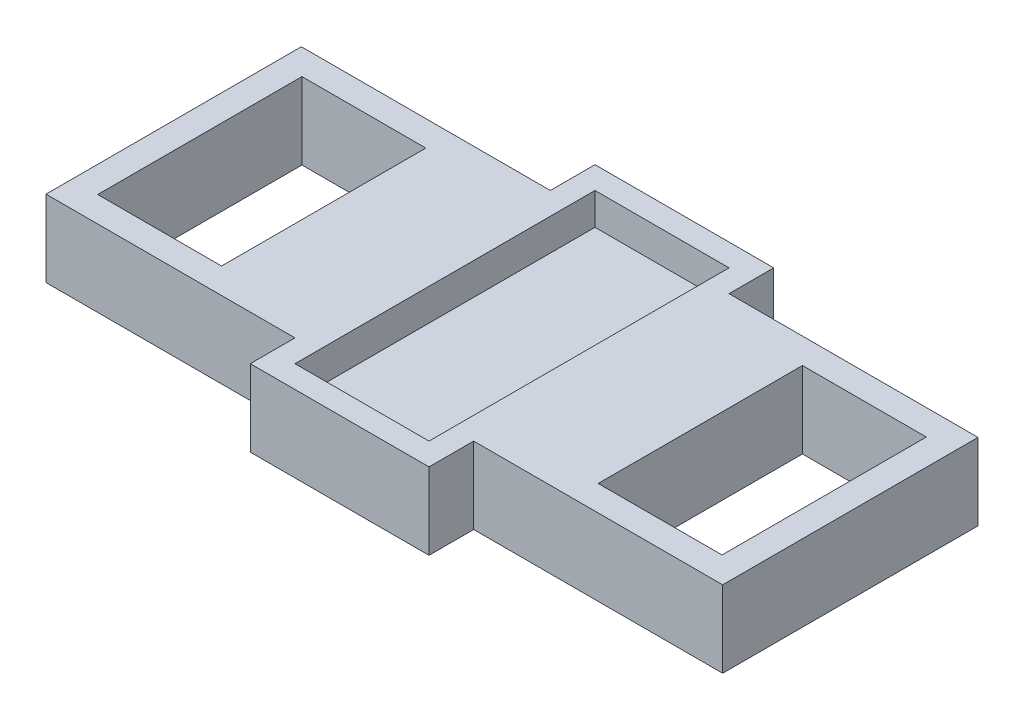
ISO-10303-21;
HEADER;
FILE_DESCRIPTION(('STEP AP214'),'2;1');
FILE_NAME('part.step','',(''),(''),'','','');
FILE_SCHEMA(('AUTOMOTIVE_DESIGN { 1 0 10303 214 1 1 1 1 }'));
ENDSEC;
DATA;
#1=APPLICATION_CONTEXT('core data for automotive mechanical design processes');
#2=APPLICATION_PROTOCOL_DEFINITION('international standard','automotive_design',2000,#1);
#3=PRODUCT_CONTEXT('',#1,'mechanical');
#4=PRODUCT('Part','Part','',(#3));
#5=PRODUCT_RELATED_PRODUCT_CATEGORY('part','',(#4));
#6=PRODUCT_DEFINITION_FORMATION('','',#4);
#7=PRODUCT_DEFINITION_CONTEXT('part definition',#1,'design');
#8=PRODUCT_DEFINITION('design','',#6,#7);
#9=PRODUCT_DEFINITION_SHAPE('','',#8);
#10=(LENGTH_UNIT() NAMED_UNIT(*) SI_UNIT(.MILLI.,.METRE.));
#11=(NAMED_UNIT(*) PLANE_ANGLE_UNIT() SI_UNIT($,.RADIAN.));
#12=(NAMED_UNIT(*) SI_UNIT($,.STERADIAN.) SOLID_ANGLE_UNIT());
#13=UNCERTAINTY_MEASURE_WITH_UNIT(LENGTH_MEASURE(1.E-05),#10,'distance_accuracy_value','');
#14=(GEOMETRIC_REPRESENTATION_CONTEXT(3) GLOBAL_UNCERTAINTY_ASSIGNED_CONTEXT((#13)) GLOBAL_UNIT_ASSIGNED_CONTEXT((#10,
#11,#12)) REPRESENTATION_CONTEXT('',''));
#15=CARTESIAN_POINT('',(0.,0.,0.));
#16=DIRECTION('',(0.,0.,1.));
#17=DIRECTION('',(1.,0.,0.));
#18=AXIS2_PLACEMENT_3D('',#15,#16,#17);
#19=CARTESIAN_POINT('',(0.,6.,0.));
#20=DIRECTION('',(0.,-1.,0.));
#21=DIRECTION('',(0.,0.,-1.));
#22=AXIS2_PLACEMENT_3D('',#19,#20,#21);
#23=PLANE('',#22);
#24=DIRECTION('',(0.,0.,1.));
#25=VECTOR('',#24,1.);
#26=CARTESIAN_POINT('',(24.45,6.,-8.00000000000001));
#27=LINE('',#26,#25);
#28=CARTESIAN_POINT('',(24.45,6.,-8.00000000000001));
#29=VERTEX_POINT('',#28);
#30=CARTESIAN_POINT('',(24.45,6.,7.99999999999999));
#31=VERTEX_POINT('',#30);
#32=EDGE_CURVE('E273',#29,#31,#27,.T.);
#33=ORIENTED_EDGE('',*,*,#32,.T.);
#34=DIRECTION('',(-1.,0.,0.));
#35=VECTOR('',#34,1.);
#36=CARTESIAN_POINT('',(24.45,6.,7.99999999999999));
#37=LINE('',#36,#35);
#38=CARTESIAN_POINT('',(14.75,6.,8.));
#39=VERTEX_POINT('',#38);
#40=EDGE_CURVE('E270',#31,#39,#37,.T.);
#41=ORIENTED_EDGE('',*,*,#40,.T.);
#42=DIRECTION('',(0.,0.,1.));
#43=VECTOR('',#42,1.);
#44=CARTESIAN_POINT('',(14.75,6.,-8.));
#45=LINE('',#44,#43);
#46=CARTESIAN_POINT('',(14.75,6.,-8.));
#47=VERTEX_POINT('',#46);
#48=EDGE_CURVE('E267',#47,#39,#45,.T.);
#49=ORIENTED_EDGE('',*,*,#48,.F.);
#50=DIRECTION('',(-1.,0.,0.));
#51=VECTOR('',#50,1.);
#52=CARTESIAN_POINT('',(24.45,6.,-8.00000000000001));
#53=LINE('',#52,#51);
#54=EDGE_CURVE('E264',#29,#47,#53,.T.);
#55=ORIENTED_EDGE('',*,*,#54,.F.);
#56=EDGE_LOOP('',(#33,#41,#49,#55));
#57=FACE_BOUND('',#56,.T.);
#58=DIRECTION('',(-1.,0.,0.));
#59=VECTOR('',#58,1.);
#60=CARTESIAN_POINT('',(-7.,6.,-10.));
#61=LINE('',#60,#59);
#62=CARTESIAN_POINT('',(-7.,6.,-10.));
#63=VERTEX_POINT('',#62);
#64=CARTESIAN_POINT('',(-26.5,6.,-10.));
#65=VERTEX_POINT('',#64);
#66=EDGE_CURVE('E282',#63,#65,#61,.T.);
#67=ORIENTED_EDGE('',*,*,#66,.T.);
#68=DIRECTION('',(0.,0.,1.));
#69=VECTOR('',#68,1.);
#70=CARTESIAN_POINT('',(-26.5,6.,10.));
#71=LINE('',#70,#69);
#72=CARTESIAN_POINT('',(-26.5,6.,10.));
#73=VERTEX_POINT('',#72);
#74=EDGE_CURVE('E285',#65,#73,#71,.T.);
#75=ORIENTED_EDGE('',*,*,#74,.T.);
#76=DIRECTION('',(1.,0.,0.));
#77=VECTOR('',#76,1.);
#78=CARTESIAN_POINT('',(-7.,6.,10.));
#79=LINE('',#78,#77);
#80=CARTESIAN_POINT('',(-7.,6.,10.));
#81=VERTEX_POINT('',#80);
#82=EDGE_CURVE('E288',#73,#81,#79,.T.);
#83=ORIENTED_EDGE('',*,*,#82,.T.);
#84=DIRECTION('',(0.,0.,1.));
#85=VECTOR('',#84,1.);
#86=CARTESIAN_POINT('',(-7.,6.,13.5));
#87=LINE('',#86,#85);
#88=CARTESIAN_POINT('',(-7.,6.,13.5));
#89=VERTEX_POINT('',#88);
#90=EDGE_CURVE('E290',#81,#89,#87,.T.);
#91=ORIENTED_EDGE('',*,*,#90,.T.);
#92=DIRECTION('',(1.,0.,0.));
#93=VECTOR('',#92,1.);
#94=CARTESIAN_POINT('',(7.,6.,13.5));
#95=LINE('',#94,#93);
#96=CARTESIAN_POINT('',(7.,6.,13.5));
#97=VERTEX_POINT('',#96);
#98=EDGE_CURVE('E292',#89,#97,#95,.T.);
#99=ORIENTED_EDGE('',*,*,#98,.T.);
#100=DIRECTION('',(0.,0.,-1.));
#101=VECTOR('',#100,1.);
#102=CARTESIAN_POINT('',(7.,6.,13.5));
#103=LINE('',#102,#101);
#104=CARTESIAN_POINT('',(7.,6.,10.));
#105=VERTEX_POINT('',#104);
#106=EDGE_CURVE('E294',#97,#105,#103,.T.);
#107=ORIENTED_EDGE('',*,*,#106,.T.);
#108=DIRECTION('',(1.,0.,0.));
#109=VECTOR('',#108,1.);
#110=CARTESIAN_POINT('',(26.5,6.,10.));
#111=LINE('',#110,#109);
#112=CARTESIAN_POINT('',(26.5,6.,10.));
#113=VERTEX_POINT('',#112);
#114=EDGE_CURVE('E296',#105,#113,#111,.T.);
#115=ORIENTED_EDGE('',*,*,#114,.T.);
#116=DIRECTION('',(0.,0.,-1.));
#117=VECTOR('',#116,1.);
#118=CARTESIAN_POINT('',(26.5,6.,10.));
#119=LINE('',#118,#117);
#120=CARTESIAN_POINT('',(26.5,6.,-10.));
#121=VERTEX_POINT('',#120);
#122=EDGE_CURVE('E298',#113,#121,#119,.T.);
#123=ORIENTED_EDGE('',*,*,#122,.T.);
#124=DIRECTION('',(-1.,0.,0.));
#125=VECTOR('',#124,1.);
#126=CARTESIAN_POINT('',(26.5,6.,-10.));
#127=LINE('',#126,#125);
#128=CARTESIAN_POINT('',(7.,6.,-10.));
#129=VERTEX_POINT('',#128);
#130=EDGE_CURVE('E300',#121,#129,#127,.T.);
#131=ORIENTED_EDGE('',*,*,#130,.T.);
#132=DIRECTION('',(0.,0.,-1.));
#133=VECTOR('',#132,1.);
#134=CARTESIAN_POINT('',(7.,6.,-10.));
#135=LINE('',#134,#133);
#136=CARTESIAN_POINT('',(7.,6.,-13.5));
#137=VERTEX_POINT('',#136);
#138=EDGE_CURVE('E302',#129,#137,#135,.T.);
#139=ORIENTED_EDGE('',*,*,#138,.T.);
#140=DIRECTION('',(-1.,0.,0.));
#141=VECTOR('',#140,1.);
#142=CARTESIAN_POINT('',(7.,6.,-13.5));
#143=LINE('',#142,#141);
#144=CARTESIAN_POINT('',(-7.,6.,-13.5));
#145=VERTEX_POINT('',#144);
#146=EDGE_CURVE('E304',#137,#145,#143,.T.);
#147=ORIENTED_EDGE('',*,*,#146,.T.);
#148=DIRECTION('',(0.,0.,1.));
#149=VECTOR('',#148,1.);
#150=CARTESIAN_POINT('',(-7.,6.,-10.));
#151=LINE('',#150,#149);
#152=EDGE_CURVE('E306',#145,#63,#151,.T.);
#153=ORIENTED_EDGE('',*,*,#152,.T.);
#154=EDGE_LOOP('',(#67,#75,#83,#91,#99,#107,#115,#123,#131,#139,#147,#153));
#155=FACE_BOUND('',#154,.T.);
#156=DIRECTION('',(1.,0.,0.));
#157=VECTOR('',#156,1.);
#158=CARTESIAN_POINT('',(-24.45,6.,8.));
#159=LINE('',#158,#157);
#160=CARTESIAN_POINT('',(-24.45,6.,8.));
#161=VERTEX_POINT('',#160);
#162=CARTESIAN_POINT('',(-14.75,6.,8.));
#163=VERTEX_POINT('',#162);
#164=EDGE_CURVE('E235',#161,#163,#159,.T.);
#165=ORIENTED_EDGE('',*,*,#164,.F.);
#166=DIRECTION('',(0.,0.,1.));
#167=VECTOR('',#166,1.);
#168=CARTESIAN_POINT('',(-24.45,6.,-8.));
#169=LINE('',#168,#167);
#170=CARTESIAN_POINT('',(-24.45,6.,-8.));
#171=VERTEX_POINT('',#170);
#172=EDGE_CURVE('E56',#171,#161,#169,.T.);
#173=ORIENTED_EDGE('',*,*,#172,.F.);
#174=DIRECTION('',(1.,0.,0.));
#175=VECTOR('',#174,1.);
#176=CARTESIAN_POINT('',(-24.45,6.,-8.));
#177=LINE('',#176,#175);
#178=CARTESIAN_POINT('',(-14.75,6.,-8.));
#179=VERTEX_POINT('',#178);
#180=EDGE_CURVE('E241',#171,#179,#177,.T.);
#181=ORIENTED_EDGE('',*,*,#180,.T.);
#182=DIRECTION('',(0.,0.,1.));
#183=VECTOR('',#182,1.);
#184=CARTESIAN_POINT('',(-14.75,6.,-8.));
#185=LINE('',#184,#183);
#186=EDGE_CURVE('E238',#179,#163,#185,.T.);
#187=ORIENTED_EDGE('',*,*,#186,.T.);
#188=EDGE_LOOP('',(#165,#173,#181,#187));
#189=FACE_BOUND('',#188,.T.);
#190=DIRECTION('',(0.,0.,-1.));
#191=VECTOR('',#190,1.);
#192=CARTESIAN_POINT('',(-5.25,6.,-11.75));
#193=LINE('',#192,#191);
#194=CARTESIAN_POINT('',(-5.25,6.,11.75));
#195=VERTEX_POINT('',#194);
#196=CARTESIAN_POINT('',(-5.25,6.,-11.75));
#197=VERTEX_POINT('',#196);
#198=EDGE_CURVE('E48',#195,#197,#193,.T.);
#199=ORIENTED_EDGE('',*,*,#198,.T.);
#200=DIRECTION('',(1.,0.,0.));
#201=VECTOR('',#200,1.);
#202=CARTESIAN_POINT('',(5.25,6.,-11.75));
#203=LINE('',#202,#201);
#204=CARTESIAN_POINT('',(5.25,6.,-11.75));
#205=VERTEX_POINT('',#204);
#206=EDGE_CURVE('E214',#197,#205,#203,.T.);
#207=ORIENTED_EDGE('',*,*,#206,.T.);
#208=DIRECTION('',(0.,0.,1.));
#209=VECTOR('',#208,1.);
#210=CARTESIAN_POINT('',(5.25,6.,-11.75));
#211=LINE('',#210,#209);
#212=CARTESIAN_POINT('',(5.25,6.,11.75));
#213=VERTEX_POINT('',#212);
#214=EDGE_CURVE('E663',#205,#213,#211,.T.);
#215=ORIENTED_EDGE('',*,*,#214,.T.);
#216=DIRECTION('',(-1.,0.,0.));
#217=VECTOR('',#216,1.);
#218=CARTESIAN_POINT('',(5.25,6.,11.75));
#219=LINE('',#218,#217);
#220=EDGE_CURVE('E210',#213,#195,#219,.T.);
#221=ORIENTED_EDGE('',*,*,#220,.T.);
#222=EDGE_LOOP('',(#199,#207,#215,#221));
#223=FACE_BOUND('',#222,.T.);
#224=ADVANCED_FACE('F33',(#57,#155,#189,#223),#23,.F.);
#225=CARTESIAN_POINT('',(0.,0.,0.));
#226=DIRECTION('',(0.,-1.,0.));
#227=DIRECTION('',(0.,0.,-1.));
#228=AXIS2_PLACEMENT_3D('',#225,#226,#227);
#229=PLANE('',#228);
#230=DIRECTION('',(0.,0.,1.));
#231=VECTOR('',#230,1.);
#232=CARTESIAN_POINT('',(-24.45,0.,-8.));
#233=LINE('',#232,#231);
#234=CARTESIAN_POINT('',(-24.45,0.,-8.));
#235=VERTEX_POINT('',#234);
#236=CARTESIAN_POINT('',(-24.45,0.,8.));
#237=VERTEX_POINT('',#236);
#238=EDGE_CURVE('E231',#235,#237,#233,.T.);
#239=ORIENTED_EDGE('',*,*,#238,.T.);
#240=DIRECTION('',(1.,0.,0.));
#241=VECTOR('',#240,1.);
#242=CARTESIAN_POINT('',(-24.45,0.,8.));
#243=LINE('',#242,#241);
#244=CARTESIAN_POINT('',(-14.75,0.,8.));
#245=VERTEX_POINT('',#244);
#246=EDGE_CURVE('E247',#237,#245,#243,.T.);
#247=ORIENTED_EDGE('',*,*,#246,.T.);
#248=DIRECTION('',(0.,0.,1.));
#249=VECTOR('',#248,1.);
#250=CARTESIAN_POINT('',(-14.75,0.,-8.));
#251=LINE('',#250,#249);
#252=CARTESIAN_POINT('',(-14.75,0.,-8.));
#253=VERTEX_POINT('',#252);
#254=EDGE_CURVE('E225',#253,#245,#251,.T.);
#255=ORIENTED_EDGE('',*,*,#254,.F.);
#256=DIRECTION('',(1.,0.,0.));
#257=VECTOR('',#256,1.);
#258=CARTESIAN_POINT('',(-24.45,0.,-8.));
#259=LINE('',#258,#257);
#260=EDGE_CURVE('E228',#235,#253,#259,.T.);
#261=ORIENTED_EDGE('',*,*,#260,.F.);
#262=EDGE_LOOP('',(#239,#247,#255,#261));
#263=FACE_BOUND('',#262,.T.);
#264=DIRECTION('',(-1.,0.,0.));
#265=VECTOR('',#264,1.);
#266=CARTESIAN_POINT('',(-7.,0.,-10.));
#267=LINE('',#266,#265);
#268=CARTESIAN_POINT('',(-7.,0.,-10.));
#269=VERTEX_POINT('',#268);
#270=CARTESIAN_POINT('',(-26.5,0.,-10.));
#271=VERTEX_POINT('',#270);
#272=EDGE_CURVE('E254',#269,#271,#267,.T.);
#273=ORIENTED_EDGE('',*,*,#272,.F.);
#274=DIRECTION('',(0.,0.,1.));
#275=VECTOR('',#274,1.);
#276=CARTESIAN_POINT('',(-7.,0.,-10.));
#277=LINE('',#276,#275);
#278=CARTESIAN_POINT('',(-7.,0.,-13.5));
#279=VERTEX_POINT('',#278);
#280=EDGE_CURVE('E286',#279,#269,#277,.T.);
#281=ORIENTED_EDGE('',*,*,#280,.F.);
#282=DIRECTION('',(-1.,0.,0.));
#283=VECTOR('',#282,1.);
#284=CARTESIAN_POINT('',(7.,0.,-13.5));
#285=LINE('',#284,#283);
#286=CARTESIAN_POINT('',(7.,0.,-13.5));
#287=VERTEX_POINT('',#286);
#288=EDGE_CURVE('E329',#287,#279,#285,.T.);
#289=ORIENTED_EDGE('',*,*,#288,.F.);
#290=DIRECTION('',(0.,0.,-1.));
#291=VECTOR('',#290,1.);
#292=CARTESIAN_POINT('',(7.,0.,-10.));
#293=LINE('',#292,#291);
#294=CARTESIAN_POINT('',(7.,0.,-10.));
#295=VERTEX_POINT('',#294);
#296=EDGE_CURVE('E327',#295,#287,#293,.T.);
#297=ORIENTED_EDGE('',*,*,#296,.F.);
#298=DIRECTION('',(-1.,0.,0.));
#299=VECTOR('',#298,1.);
#300=CARTESIAN_POINT('',(26.5,0.,-10.));
#301=LINE('',#300,#299);
#302=CARTESIAN_POINT('',(26.5,0.,-10.));
#303=VERTEX_POINT('',#302);
#304=EDGE_CURVE('E325',#303,#295,#301,.T.);
#305=ORIENTED_EDGE('',*,*,#304,.F.);
#306=DIRECTION('',(0.,0.,-1.));
#307=VECTOR('',#306,1.);
#308=CARTESIAN_POINT('',(26.5,0.,10.));
#309=LINE('',#308,#307);
#310=CARTESIAN_POINT('',(26.5,0.,10.));
#311=VERTEX_POINT('',#310);
#312=EDGE_CURVE('E323',#311,#303,#309,.T.);
#313=ORIENTED_EDGE('',*,*,#312,.F.);
#314=DIRECTION('',(1.,0.,0.));
#315=VECTOR('',#314,1.);
#316=CARTESIAN_POINT('',(26.5,0.,10.));
#317=LINE('',#316,#315);
#318=CARTESIAN_POINT('',(7.,0.,10.));
#319=VERTEX_POINT('',#318);
#320=EDGE_CURVE('E321',#319,#311,#317,.T.);
#321=ORIENTED_EDGE('',*,*,#320,.F.);
#322=DIRECTION('',(0.,0.,-1.));
#323=VECTOR('',#322,1.);
#324=CARTESIAN_POINT('',(7.,0.,13.5));
#325=LINE('',#324,#323);
#326=CARTESIAN_POINT('',(7.,0.,13.5));
#327=VERTEX_POINT('',#326);
#328=EDGE_CURVE('E319',#327,#319,#325,.T.);
#329=ORIENTED_EDGE('',*,*,#328,.F.);
#330=DIRECTION('',(1.,0.,0.));
#331=VECTOR('',#330,1.);
#332=CARTESIAN_POINT('',(7.,0.,13.5));
#333=LINE('',#332,#331);
#334=CARTESIAN_POINT('',(-7.,0.,13.5));
#335=VERTEX_POINT('',#334);
#336=EDGE_CURVE('E317',#335,#327,#333,.T.);
#337=ORIENTED_EDGE('',*,*,#336,.F.);
#338=DIRECTION('',(0.,0.,1.));
#339=VECTOR('',#338,1.);
#340=CARTESIAN_POINT('',(-7.,0.,13.5));
#341=LINE('',#340,#339);
#342=CARTESIAN_POINT('',(-7.,0.,10.));
#343=VERTEX_POINT('',#342);
#344=EDGE_CURVE('E315',#343,#335,#341,.T.);
#345=ORIENTED_EDGE('',*,*,#344,.F.);
#346=DIRECTION('',(1.,0.,0.));
#347=VECTOR('',#346,1.);
#348=CARTESIAN_POINT('',(-7.,0.,10.));
#349=LINE('',#348,#347);
#350=CARTESIAN_POINT('',(-26.5,0.,10.));
#351=VERTEX_POINT('',#350);
#352=EDGE_CURVE('E313',#351,#343,#349,.T.);
#353=ORIENTED_EDGE('',*,*,#352,.F.);
#354=DIRECTION('',(0.,0.,1.));
#355=VECTOR('',#354,1.);
#356=CARTESIAN_POINT('',(-26.5,0.,10.));
#357=LINE('',#356,#355);
#358=EDGE_CURVE('E311',#271,#351,#357,.T.);
#359=ORIENTED_EDGE('',*,*,#358,.F.);
#360=EDGE_LOOP('',(#273,#281,#289,#297,#305,#313,#321,#329,#337,#345,#353,#359));
#361=FACE_BOUND('',#360,.T.);
#362=DIRECTION('',(-1.,0.,0.));
#363=VECTOR('',#362,1.);
#364=CARTESIAN_POINT('',(24.45,0.,7.99999999999999));
#365=LINE('',#364,#363);
#366=CARTESIAN_POINT('',(24.45,0.,7.99999999999999));
#367=VERTEX_POINT('',#366);
#368=CARTESIAN_POINT('',(14.75,0.,8.));
#369=VERTEX_POINT('',#368);
#370=EDGE_CURVE('E278',#367,#369,#365,.T.);
#371=ORIENTED_EDGE('',*,*,#370,.F.);
#372=DIRECTION('',(0.,0.,1.));
#373=VECTOR('',#372,1.);
#374=CARTESIAN_POINT('',(24.45,0.,-8.00000000000001));
#375=LINE('',#374,#373);
#376=CARTESIAN_POINT('',(24.45,0.,-8.00000000000001));
#377=VERTEX_POINT('',#376);
#378=EDGE_CURVE('E276',#377,#367,#375,.T.);
#379=ORIENTED_EDGE('',*,*,#378,.F.);
#380=DIRECTION('',(-1.,0.,0.));
#381=VECTOR('',#380,1.);
#382=CARTESIAN_POINT('',(24.45,0.,-8.00000000000001));
#383=LINE('',#382,#381);
#384=CARTESIAN_POINT('',(14.75,0.,-8.));
#385=VERTEX_POINT('',#384);
#386=EDGE_CURVE('E215',#377,#385,#383,.T.);
#387=ORIENTED_EDGE('',*,*,#386,.T.);
#388=DIRECTION('',(0.,0.,1.));
#389=VECTOR('',#388,1.);
#390=CARTESIAN_POINT('',(14.75,0.,-8.));
#391=LINE('',#390,#389);
#392=EDGE_CURVE('E229',#385,#369,#391,.T.);
#393=ORIENTED_EDGE('',*,*,#392,.T.);
#394=EDGE_LOOP('',(#371,#379,#387,#393));
#395=FACE_BOUND('',#394,.T.);
#396=ADVANCED_FACE('F371',(#263,#361,#395),#229,.T.);
#397=CARTESIAN_POINT('',(-7.,6.,-10.));
#398=DIRECTION('',(0.,0.,1.));
#399=DIRECTION('',(1.,0.,0.));
#400=AXIS2_PLACEMENT_3D('',#397,#398,#399);
#401=PLANE('',#400);
#402=ORIENTED_EDGE('',*,*,#272,.T.);
#403=DIRECTION('',(0.,-1.,0.));
#404=VECTOR('',#403,1.);
#405=CARTESIAN_POINT('',(-26.5,6.,-10.));
#406=LINE('',#405,#404);
#407=EDGE_CURVE('E11',#65,#271,#406,.T.);
#408=ORIENTED_EDGE('',*,*,#407,.F.);
#409=ORIENTED_EDGE('',*,*,#66,.F.);
#410=DIRECTION('',(0.,-1.,0.));
#411=VECTOR('',#410,1.);
#412=CARTESIAN_POINT('',(-7.,6.,-10.));
#413=LINE('',#412,#411);
#414=EDGE_CURVE('E308',#63,#269,#413,.T.);
#415=ORIENTED_EDGE('',*,*,#414,.T.);
#416=EDGE_LOOP('',(#402,#408,#409,#415));
#417=FACE_BOUND('',#416,.T.);
#418=ADVANCED_FACE('F35',(#417),#401,.F.);
#419=CARTESIAN_POINT('',(-26.5,6.,10.));
#420=DIRECTION('',(1.,0.,0.));
#421=DIRECTION('',(0.,0.,-1.));
#422=AXIS2_PLACEMENT_3D('',#419,#420,#421);
#423=PLANE('',#422);
#424=ORIENTED_EDGE('',*,*,#358,.T.);
#425=DIRECTION('',(0.,-1.,0.));
#426=VECTOR('',#425,1.);
#427=CARTESIAN_POINT('',(-26.5,6.,10.));
#428=LINE('',#427,#426);
#429=EDGE_CURVE('E41',#73,#351,#428,.T.);
#430=ORIENTED_EDGE('',*,*,#429,.F.);
#431=ORIENTED_EDGE('',*,*,#74,.F.);
#432=ORIENTED_EDGE('',*,*,#407,.T.);
#433=EDGE_LOOP('',(#424,#430,#431,#432));
#434=FACE_BOUND('',#433,.T.);
#435=ADVANCED_FACE('F389',(#434),#423,.F.);
#436=CARTESIAN_POINT('',(-7.,6.,10.));
#437=DIRECTION('',(0.,0.,-1.));
#438=DIRECTION('',(-1.,0.,0.));
#439=AXIS2_PLACEMENT_3D('',#436,#437,#438);
#440=PLANE('',#439);
#441=ORIENTED_EDGE('',*,*,#352,.T.);
#442=DIRECTION('',(0.,-1.,0.));
#443=VECTOR('',#442,1.);
#444=CARTESIAN_POINT('',(-7.,6.,10.));
#445=LINE('',#444,#443);
#446=EDGE_CURVE('E358',#81,#343,#445,.T.);
#447=ORIENTED_EDGE('',*,*,#446,.F.);
#448=ORIENTED_EDGE('',*,*,#82,.F.);
#449=ORIENTED_EDGE('',*,*,#429,.T.);
#450=EDGE_LOOP('',(#441,#447,#448,#449));
#451=FACE_BOUND('',#450,.T.);
#452=ADVANCED_FACE('F365',(#451),#440,.F.);
#453=CARTESIAN_POINT('',(-7.,6.,13.5));
#454=DIRECTION('',(1.,0.,0.));
#455=DIRECTION('',(0.,0.,-1.));
#456=AXIS2_PLACEMENT_3D('',#453,#454,#455);
#457=PLANE('',#456);
#458=ORIENTED_EDGE('',*,*,#344,.T.);
#459=DIRECTION('',(0.,-1.,0.));
#460=VECTOR('',#459,1.);
#461=CARTESIAN_POINT('',(-7.,6.,13.5));
#462=LINE('',#461,#460);
#463=EDGE_CURVE('E355',#89,#335,#462,.T.);
#464=ORIENTED_EDGE('',*,*,#463,.F.);
#465=ORIENTED_EDGE('',*,*,#90,.F.);
#466=ORIENTED_EDGE('',*,*,#446,.T.);
#467=EDGE_LOOP('',(#458,#464,#465,#466));
#468=FACE_BOUND('',#467,.T.);
#469=ADVANCED_FACE('F377',(#468),#457,.F.);
#470=CARTESIAN_POINT('',(7.,6.,13.5));
#471=DIRECTION('',(0.,0.,-1.));
#472=DIRECTION('',(-1.,0.,0.));
#473=AXIS2_PLACEMENT_3D('',#470,#471,#472);
#474=PLANE('',#473);
#475=ORIENTED_EDGE('',*,*,#336,.T.);
#476=DIRECTION('',(0.,-1.,0.));
#477=VECTOR('',#476,1.);
#478=CARTESIAN_POINT('',(7.,6.,13.5));
#479=LINE('',#478,#477);
#480=EDGE_CURVE('E352',#97,#327,#479,.T.);
#481=ORIENTED_EDGE('',*,*,#480,.F.);
#482=ORIENTED_EDGE('',*,*,#98,.F.);
#483=ORIENTED_EDGE('',*,*,#463,.T.);
#484=EDGE_LOOP('',(#475,#481,#482,#483));
#485=FACE_BOUND('',#484,.T.);
#486=ADVANCED_FACE('F381',(#485),#474,.F.);
#487=CARTESIAN_POINT('',(7.,6.,13.5));
#488=DIRECTION('',(-1.,0.,0.));
#489=DIRECTION('',(0.,0.,1.));
#490=AXIS2_PLACEMENT_3D('',#487,#488,#489);
#491=PLANE('',#490);
#492=ORIENTED_EDGE('',*,*,#328,.T.);
#493=DIRECTION('',(0.,-1.,0.));
#494=VECTOR('',#493,1.);
#495=CARTESIAN_POINT('',(7.,6.,10.));
#496=LINE('',#495,#494);
#497=EDGE_CURVE('E349',#105,#319,#496,.T.);
#498=ORIENTED_EDGE('',*,*,#497,.F.);
#499=ORIENTED_EDGE('',*,*,#106,.F.);
#500=ORIENTED_EDGE('',*,*,#480,.T.);
#501=EDGE_LOOP('',(#492,#498,#499,#500));
#502=FACE_BOUND('',#501,.T.);
#503=ADVANCED_FACE('F422',(#502),#491,.F.);
#504=CARTESIAN_POINT('',(26.5,6.,10.));
#505=DIRECTION('',(0.,0.,-1.));
#506=DIRECTION('',(-1.,0.,0.));
#507=AXIS2_PLACEMENT_3D('',#504,#505,#506);
#508=PLANE('',#507);
#509=ORIENTED_EDGE('',*,*,#320,.T.);
#510=DIRECTION('',(0.,-1.,0.));
#511=VECTOR('',#510,1.);
#512=CARTESIAN_POINT('',(26.5,6.,10.));
#513=LINE('',#512,#511);
#514=EDGE_CURVE('E346',#113,#311,#513,.T.);
#515=ORIENTED_EDGE('',*,*,#514,.F.);
#516=ORIENTED_EDGE('',*,*,#114,.F.);
#517=ORIENTED_EDGE('',*,*,#497,.T.);
#518=EDGE_LOOP('',(#509,#515,#516,#517));
#519=FACE_BOUND('',#518,.T.);
#520=ADVANCED_FACE('F420',(#519),#508,.F.);
#521=CARTESIAN_POINT('',(26.5,6.,10.));
#522=DIRECTION('',(-1.,0.,0.));
#523=DIRECTION('',(0.,0.,1.));
#524=AXIS2_PLACEMENT_3D('',#521,#522,#523);
#525=PLANE('',#524);
#526=ORIENTED_EDGE('',*,*,#312,.T.);
#527=DIRECTION('',(0.,-1.,0.));
#528=VECTOR('',#527,1.);
#529=CARTESIAN_POINT('',(26.5,6.,-10.));
#530=LINE('',#529,#528);
#531=EDGE_CURVE('E343',#121,#303,#530,.T.);
#532=ORIENTED_EDGE('',*,*,#531,.F.);
#533=ORIENTED_EDGE('',*,*,#122,.F.);
#534=ORIENTED_EDGE('',*,*,#514,.T.);
#535=EDGE_LOOP('',(#526,#532,#533,#534));
#536=FACE_BOUND('',#535,.T.);
#537=ADVANCED_FACE('F416',(#536),#525,.F.);
#538=CARTESIAN_POINT('',(26.5,6.,-10.));
#539=DIRECTION('',(0.,0.,1.));
#540=DIRECTION('',(1.,0.,0.));
#541=AXIS2_PLACEMENT_3D('',#538,#539,#540);
#542=PLANE('',#541);
#543=ORIENTED_EDGE('',*,*,#304,.T.);
#544=DIRECTION('',(0.,-1.,0.));
#545=VECTOR('',#544,1.);
#546=CARTESIAN_POINT('',(7.,6.,-10.));
#547=LINE('',#546,#545);
#548=EDGE_CURVE('E340',#129,#295,#547,.T.);
#549=ORIENTED_EDGE('',*,*,#548,.F.);
#550=ORIENTED_EDGE('',*,*,#130,.F.);
#551=ORIENTED_EDGE('',*,*,#531,.T.);
#552=EDGE_LOOP('',(#543,#549,#550,#551));
#553=FACE_BOUND('',#552,.T.);
#554=ADVANCED_FACE('F411',(#553),#542,.F.);
#555=CARTESIAN_POINT('',(7.,6.,-10.));
#556=DIRECTION('',(-1.,0.,0.));
#557=DIRECTION('',(0.,0.,1.));
#558=AXIS2_PLACEMENT_3D('',#555,#556,#557);
#559=PLANE('',#558);
#560=ORIENTED_EDGE('',*,*,#296,.T.);
#561=DIRECTION('',(0.,-1.,0.));
#562=VECTOR('',#561,1.);
#563=CARTESIAN_POINT('',(7.,6.,-13.5));
#564=LINE('',#563,#562);
#565=EDGE_CURVE('E337',#137,#287,#564,.T.);
#566=ORIENTED_EDGE('',*,*,#565,.F.);
#567=ORIENTED_EDGE('',*,*,#138,.F.);
#568=ORIENTED_EDGE('',*,*,#548,.T.);
#569=EDGE_LOOP('',(#560,#566,#567,#568));
#570=FACE_BOUND('',#569,.T.);
#571=ADVANCED_FACE('F405',(#570),#559,.F.);
#572=CARTESIAN_POINT('',(7.,6.,-13.5));
#573=DIRECTION('',(0.,0.,1.));
#574=DIRECTION('',(1.,0.,0.));
#575=AXIS2_PLACEMENT_3D('',#572,#573,#574);
#576=PLANE('',#575);
#577=ORIENTED_EDGE('',*,*,#288,.T.);
#578=DIRECTION('',(0.,-1.,0.));
#579=VECTOR('',#578,1.);
#580=CARTESIAN_POINT('',(-7.,6.,-13.5));
#581=LINE('',#580,#579);
#582=EDGE_CURVE('E334',#145,#279,#581,.T.);
#583=ORIENTED_EDGE('',*,*,#582,.F.);
#584=ORIENTED_EDGE('',*,*,#146,.F.);
#585=ORIENTED_EDGE('',*,*,#565,.T.);
#586=EDGE_LOOP('',(#577,#583,#584,#585));
#587=FACE_BOUND('',#586,.T.);
#588=ADVANCED_FACE('F401',(#587),#576,.F.);
#589=CARTESIAN_POINT('',(-7.,6.,-10.));
#590=DIRECTION('',(1.,0.,0.));
#591=DIRECTION('',(0.,0.,-1.));
#592=AXIS2_PLACEMENT_3D('',#589,#590,#591);
#593=PLANE('',#592);
#594=ORIENTED_EDGE('',*,*,#280,.T.);
#595=ORIENTED_EDGE('',*,*,#414,.F.);
#596=ORIENTED_EDGE('',*,*,#152,.F.);
#597=ORIENTED_EDGE('',*,*,#582,.T.);
#598=EDGE_LOOP('',(#594,#595,#596,#597));
#599=FACE_BOUND('',#598,.T.);
#600=ADVANCED_FACE('F396',(#599),#593,.F.);
#601=CARTESIAN_POINT('',(24.45,-0.00100000000000013,-8.00000000000001));
#602=DIRECTION('',(-1.,0.,0.));
#603=DIRECTION('',(0.,0.,1.));
#604=AXIS2_PLACEMENT_3D('',#601,#602,#603);
#605=PLANE('',#604);
#606=ORIENTED_EDGE('',*,*,#378,.T.);
#607=DIRECTION('',(0.,1.,0.));
#608=VECTOR('',#607,1.);
#609=CARTESIAN_POINT('',(24.45,-0.00100000000000013,7.99999999999999));
#610=LINE('',#609,#608);
#611=EDGE_CURVE('E219',#367,#31,#610,.T.);
#612=ORIENTED_EDGE('',*,*,#611,.T.);
#613=ORIENTED_EDGE('',*,*,#32,.F.);
#614=DIRECTION('',(0.,1.,0.));
#615=VECTOR('',#614,1.);
#616=CARTESIAN_POINT('',(24.45,-0.00100000000000013,-8.00000000000001));
#617=LINE('',#616,#615);
#618=EDGE_CURVE('E261',#377,#29,#617,.T.);
#619=ORIENTED_EDGE('',*,*,#618,.F.);
#620=EDGE_LOOP('',(#606,#612,#613,#619));
#621=FACE_BOUND('',#620,.T.);
#622=ADVANCED_FACE('F445',(#621),#605,.T.);
#623=CARTESIAN_POINT('',(24.45,-0.00100000000000013,7.99999999999999));
#624=DIRECTION('',(0.,0.,-1.));
#625=DIRECTION('',(-1.,0.,0.));
#626=AXIS2_PLACEMENT_3D('',#623,#624,#625);
#627=PLANE('',#626);
#628=ORIENTED_EDGE('',*,*,#370,.T.);
#629=DIRECTION('',(0.,1.,0.));
#630=VECTOR('',#629,1.);
#631=CARTESIAN_POINT('',(14.75,-0.00100000000000013,8.));
#632=LINE('',#631,#630);
#633=EDGE_CURVE('E257',#369,#39,#632,.T.);
#634=ORIENTED_EDGE('',*,*,#633,.T.);
#635=ORIENTED_EDGE('',*,*,#40,.F.);
#636=ORIENTED_EDGE('',*,*,#611,.F.);
#637=EDGE_LOOP('',(#628,#634,#635,#636));
#638=FACE_BOUND('',#637,.T.);
#639=ADVANCED_FACE('F480',(#638),#627,.T.);
#640=CARTESIAN_POINT('',(14.75,-0.00100000000000013,-8.));
#641=DIRECTION('',(-1.,0.,0.));
#642=DIRECTION('',(0.,0.,1.));
#643=AXIS2_PLACEMENT_3D('',#640,#641,#642);
#644=PLANE('',#643);
#645=DIRECTION('',(0.,1.,0.));
#646=VECTOR('',#645,1.);
#647=CARTESIAN_POINT('',(14.75,-0.00100000000000013,-8.));
#648=LINE('',#647,#646);
#649=EDGE_CURVE('E259',#385,#47,#648,.T.);
#650=ORIENTED_EDGE('',*,*,#649,.T.);
#651=ORIENTED_EDGE('',*,*,#48,.T.);
#652=ORIENTED_EDGE('',*,*,#633,.F.);
#653=ORIENTED_EDGE('',*,*,#392,.F.);
#654=EDGE_LOOP('',(#650,#651,#652,#653));
#655=FACE_BOUND('',#654,.T.);
#656=ADVANCED_FACE('F488',(#655),#644,.F.);
#657=CARTESIAN_POINT('',(24.45,-0.00100000000000013,-8.00000000000001));
#658=DIRECTION('',(0.,0.,-1.));
#659=DIRECTION('',(-1.,0.,0.));
#660=AXIS2_PLACEMENT_3D('',#657,#658,#659);
#661=PLANE('',#660);
#662=ORIENTED_EDGE('',*,*,#618,.T.);
#663=ORIENTED_EDGE('',*,*,#54,.T.);
#664=ORIENTED_EDGE('',*,*,#649,.F.);
#665=ORIENTED_EDGE('',*,*,#386,.F.);
#666=EDGE_LOOP('',(#662,#663,#664,#665));
#667=FACE_BOUND('',#666,.T.);
#668=ADVANCED_FACE('F440',(#667),#661,.F.);
#669=CARTESIAN_POINT('',(-24.45,-0.00100000000000013,-8.));
#670=DIRECTION('',(-1.,0.,0.));
#671=DIRECTION('',(0.,0.,1.));
#672=AXIS2_PLACEMENT_3D('',#669,#670,#671);
#673=PLANE('',#672);
#674=DIRECTION('',(0.,1.,0.));
#675=VECTOR('',#674,1.);
#676=CARTESIAN_POINT('',(-24.45,-0.00100000000000013,-8.));
#677=LINE('',#676,#675);
#678=EDGE_CURVE('E245',#235,#171,#677,.T.);
#679=ORIENTED_EDGE('',*,*,#678,.T.);
#680=ORIENTED_EDGE('',*,*,#172,.T.);
#681=DIRECTION('',(0.,1.,0.));
#682=VECTOR('',#681,1.);
#683=CARTESIAN_POINT('',(-24.45,-0.00100000000000013,8.));
#684=LINE('',#683,#682);
#685=EDGE_CURVE('E244',#237,#161,#684,.T.);
#686=ORIENTED_EDGE('',*,*,#685,.F.);
#687=ORIENTED_EDGE('',*,*,#238,.F.);
#688=EDGE_LOOP('',(#679,#680,#686,#687));
#689=FACE_BOUND('',#688,.T.);
#690=ADVANCED_FACE('F502',(#689),#673,.F.);
#691=CARTESIAN_POINT('',(-24.45,-0.00100000000000013,-8.));
#692=DIRECTION('',(0.,0.,1.));
#693=DIRECTION('',(1.,0.,0.));
#694=AXIS2_PLACEMENT_3D('',#691,#692,#693);
#695=PLANE('',#694);
#696=ORIENTED_EDGE('',*,*,#260,.T.);
#697=DIRECTION('',(0.,1.,0.));
#698=VECTOR('',#697,1.);
#699=CARTESIAN_POINT('',(-14.75,-0.00100000000000013,-8.));
#700=LINE('',#699,#698);
#701=EDGE_CURVE('E248',#253,#179,#700,.T.);
#702=ORIENTED_EDGE('',*,*,#701,.T.);
#703=ORIENTED_EDGE('',*,*,#180,.F.);
#704=ORIENTED_EDGE('',*,*,#678,.F.);
#705=EDGE_LOOP('',(#696,#702,#703,#704));
#706=FACE_BOUND('',#705,.T.);
#707=ADVANCED_FACE('F509',(#706),#695,.T.);
#708=CARTESIAN_POINT('',(-14.75,-0.00100000000000013,-8.));
#709=DIRECTION('',(-1.,0.,0.));
#710=DIRECTION('',(0.,0.,1.));
#711=AXIS2_PLACEMENT_3D('',#708,#709,#710);
#712=PLANE('',#711);
#713=ORIENTED_EDGE('',*,*,#254,.T.);
#714=DIRECTION('',(0.,1.,0.));
#715=VECTOR('',#714,1.);
#716=CARTESIAN_POINT('',(-14.75,-0.00100000000000013,8.));
#717=LINE('',#716,#715);
#718=EDGE_CURVE('E250',#245,#163,#717,.T.);
#719=ORIENTED_EDGE('',*,*,#718,.T.);
#720=ORIENTED_EDGE('',*,*,#186,.F.);
#721=ORIENTED_EDGE('',*,*,#701,.F.);
#722=EDGE_LOOP('',(#713,#719,#720,#721));
#723=FACE_BOUND('',#722,.T.);
#724=ADVANCED_FACE('F516',(#723),#712,.T.);
#725=CARTESIAN_POINT('',(-24.45,-0.00100000000000013,8.));
#726=DIRECTION('',(0.,0.,1.));
#727=DIRECTION('',(1.,0.,0.));
#728=AXIS2_PLACEMENT_3D('',#725,#726,#727);
#729=PLANE('',#728);
#730=ORIENTED_EDGE('',*,*,#685,.T.);
#731=ORIENTED_EDGE('',*,*,#164,.T.);
#732=ORIENTED_EDGE('',*,*,#718,.F.);
#733=ORIENTED_EDGE('',*,*,#246,.F.);
#734=EDGE_LOOP('',(#730,#731,#732,#733));
#735=FACE_BOUND('',#734,.T.);
#736=ADVANCED_FACE('F524',(#735),#729,.F.);
#737=CARTESIAN_POINT('',(-5.25,3.5,-11.75));
#738=DIRECTION('',(1.,0.,0.));
#739=DIRECTION('',(0.,0.,-1.));
#740=AXIS2_PLACEMENT_3D('',#737,#738,#739);
#741=PLANE('',#740);
#742=ORIENTED_EDGE('',*,*,#198,.F.);
#743=DIRECTION('',(0.,1.,0.));
#744=VECTOR('',#743,1.);
#745=CARTESIAN_POINT('',(-5.25,3.5,11.75));
#746=LINE('',#745,#744);
#747=CARTESIAN_POINT('',(-5.25,3.5,11.75));
#748=VERTEX_POINT('',#747);
#749=EDGE_CURVE('E209',#748,#195,#746,.T.);
#750=ORIENTED_EDGE('',*,*,#749,.F.);
#751=DIRECTION('',(0.,0.,-1.));
#752=VECTOR('',#751,1.);
#753=CARTESIAN_POINT('',(-5.25,3.5,-11.75));
#754=LINE('',#753,#752);
#755=CARTESIAN_POINT('',(-5.25,3.5,-11.75));
#756=VERTEX_POINT('',#755);
#757=EDGE_CURVE('E201',#748,#756,#754,.T.);
#758=ORIENTED_EDGE('',*,*,#757,.T.);
#759=DIRECTION('',(0.,1.,0.));
#760=VECTOR('',#759,1.);
#761=CARTESIAN_POINT('',(-5.25,3.5,-11.75));
#762=LINE('',#761,#760);
#763=EDGE_CURVE('E208',#756,#197,#762,.T.);
#764=ORIENTED_EDGE('',*,*,#763,.T.);
#765=EDGE_LOOP('',(#742,#750,#758,#764));
#766=FACE_BOUND('',#765,.T.);
#767=ADVANCED_FACE('F207',(#766),#741,.T.);
#768=CARTESIAN_POINT('',(5.25,3.5,-11.75));
#769=DIRECTION('',(0.,0.,1.));
#770=DIRECTION('',(1.,0.,0.));
#771=AXIS2_PLACEMENT_3D('',#768,#769,#770);
#772=PLANE('',#771);
#773=ORIENTED_EDGE('',*,*,#206,.F.);
#774=ORIENTED_EDGE('',*,*,#763,.F.);
#775=DIRECTION('',(1.,0.,0.));
#776=VECTOR('',#775,1.);
#777=CARTESIAN_POINT('',(5.25,3.5,-11.75));
#778=LINE('',#777,#776);
#779=CARTESIAN_POINT('',(5.25,3.5,-11.75));
#780=VERTEX_POINT('',#779);
#781=EDGE_CURVE('E197',#756,#780,#778,.T.);
#782=ORIENTED_EDGE('',*,*,#781,.T.);
#783=DIRECTION('',(0.,1.,0.));
#784=VECTOR('',#783,1.);
#785=CARTESIAN_POINT('',(5.25,3.5,-11.75));
#786=LINE('',#785,#784);
#787=EDGE_CURVE('E216',#780,#205,#786,.T.);
#788=ORIENTED_EDGE('',*,*,#787,.T.);
#789=EDGE_LOOP('',(#773,#774,#782,#788));
#790=FACE_BOUND('',#789,.T.);
#791=ADVANCED_FACE('F212',(#790),#772,.T.);
#792=CARTESIAN_POINT('',(5.25,3.5,-11.75));
#793=DIRECTION('',(-1.,0.,0.));
#794=DIRECTION('',(0.,0.,1.));
#795=AXIS2_PLACEMENT_3D('',#792,#793,#794);
#796=PLANE('',#795);
#797=ORIENTED_EDGE('',*,*,#214,.F.);
#798=ORIENTED_EDGE('',*,*,#787,.F.);
#799=DIRECTION('',(0.,0.,1.));
#800=VECTOR('',#799,1.);
#801=CARTESIAN_POINT('',(5.25,3.5,-11.75));
#802=LINE('',#801,#800);
#803=CARTESIAN_POINT('',(5.25,3.5,11.75));
#804=VERTEX_POINT('',#803);
#805=EDGE_CURVE('E202',#780,#804,#802,.T.);
#806=ORIENTED_EDGE('',*,*,#805,.T.);
#807=DIRECTION('',(0.,1.,0.));
#808=VECTOR('',#807,1.);
#809=CARTESIAN_POINT('',(5.25,3.5,11.75));
#810=LINE('',#809,#808);
#811=EDGE_CURVE('E221',#804,#213,#810,.T.);
#812=ORIENTED_EDGE('',*,*,#811,.T.);
#813=EDGE_LOOP('',(#797,#798,#806,#812));
#814=FACE_BOUND('',#813,.T.);
#815=ADVANCED_FACE('F545',(#814),#796,.T.);
#816=CARTESIAN_POINT('',(5.25,3.5,11.75));
#817=DIRECTION('',(0.,0.,-1.));
#818=DIRECTION('',(-1.,0.,0.));
#819=AXIS2_PLACEMENT_3D('',#816,#817,#818);
#820=PLANE('',#819);
#821=ORIENTED_EDGE('',*,*,#220,.F.);
#822=ORIENTED_EDGE('',*,*,#811,.F.);
#823=DIRECTION('',(-1.,0.,0.));
#824=VECTOR('',#823,1.);
#825=CARTESIAN_POINT('',(5.25,3.5,11.75));
#826=LINE('',#825,#824);
#827=EDGE_CURVE('E670',#804,#748,#826,.T.);
#828=ORIENTED_EDGE('',*,*,#827,.T.);
#829=ORIENTED_EDGE('',*,*,#749,.T.);
#830=EDGE_LOOP('',(#821,#822,#828,#829));
#831=FACE_BOUND('',#830,.T.);
#832=ADVANCED_FACE('F552',(#831),#820,.T.);
#833=CARTESIAN_POINT('',(0.,3.5,0.));
#834=DIRECTION('',(0.,-1.,0.));
#835=DIRECTION('',(0.,0.,-1.));
#836=AXIS2_PLACEMENT_3D('',#833,#834,#835);
#837=PLANE('',#836);
#838=ORIENTED_EDGE('',*,*,#757,.F.);
#839=ORIENTED_EDGE('',*,*,#827,.F.);
#840=ORIENTED_EDGE('',*,*,#805,.F.);
#841=ORIENTED_EDGE('',*,*,#781,.F.);
#842=EDGE_LOOP('',(#838,#839,#840,#841));
#843=FACE_BOUND('',#842,.T.);
#844=ADVANCED_FACE('F199',(#843),#837,.F.);
#845=CLOSED_SHELL('',(#224,#396,#418,#435,#452,#469,#486,#503,#520,#537,#554,#571,#588,#600,
#622,#639,#656,#668,#690,#707,#724,#736,#767,#791,#815,#832,#844));
#846=MANIFOLD_SOLID_BREP('B2',#845);
#847=ADVANCED_BREP_SHAPE_REPRESENTATION('',(#18,#846),#14);
#848=SHAPE_DEFINITION_REPRESENTATION(#9,#847);
ENDSEC;
END-ISO-10303-21;
